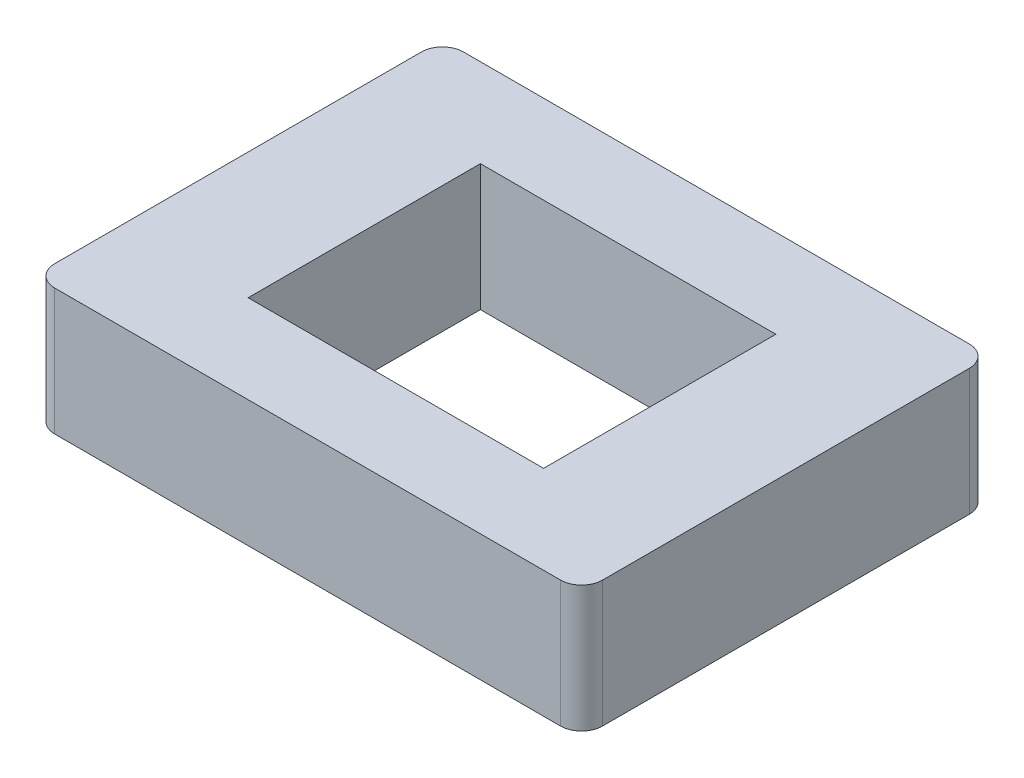
ISO-10303-21;
HEADER;
FILE_DESCRIPTION(('STEP AP214'),'2;1');
FILE_NAME('part.step','',(''),(''),'','','');
FILE_SCHEMA(('AUTOMOTIVE_DESIGN { 1 0 10303 214 1 1 1 1 }'));
ENDSEC;
DATA;
#1=APPLICATION_CONTEXT('core data for automotive mechanical design processes');
#2=APPLICATION_PROTOCOL_DEFINITION('international standard','automotive_design',2000,#1);
#3=PRODUCT_CONTEXT('',#1,'mechanical');
#4=PRODUCT('Part','Part','',(#3));
#5=PRODUCT_RELATED_PRODUCT_CATEGORY('part','',(#4));
#6=PRODUCT_DEFINITION_FORMATION('','',#4);
#7=PRODUCT_DEFINITION_CONTEXT('part definition',#1,'design');
#8=PRODUCT_DEFINITION('design','',#6,#7);
#9=PRODUCT_DEFINITION_SHAPE('','',#8);
#10=(LENGTH_UNIT() NAMED_UNIT(*) SI_UNIT(.MILLI.,.METRE.));
#11=(NAMED_UNIT(*) PLANE_ANGLE_UNIT() SI_UNIT($,.RADIAN.));
#12=(NAMED_UNIT(*) SI_UNIT($,.STERADIAN.) SOLID_ANGLE_UNIT());
#13=UNCERTAINTY_MEASURE_WITH_UNIT(LENGTH_MEASURE(1.E-05),#10,'distance_accuracy_value','');
#14=(GEOMETRIC_REPRESENTATION_CONTEXT(3) GLOBAL_UNCERTAINTY_ASSIGNED_CONTEXT((#13)) GLOBAL_UNIT_ASSIGNED_CONTEXT((#10,
#11,#12)) REPRESENTATION_CONTEXT('',''));
#15=CARTESIAN_POINT('',(0.,0.,0.));
#16=DIRECTION('',(0.,0.,1.));
#17=DIRECTION('',(1.,0.,0.));
#18=AXIS2_PLACEMENT_3D('',#15,#16,#17);
#19=CARTESIAN_POINT('',(0.,-30.,0.));
#20=DIRECTION('',(0.,-1.,0.));
#21=DIRECTION('',(0.,0.,-1.));
#22=AXIS2_PLACEMENT_3D('',#19,#20,#21);
#23=PLANE('',#22);
#24=DIRECTION('',(0.,0.,1.));
#25=VECTOR('',#24,1.);
#26=CARTESIAN_POINT('',(-65.,-30.,48.5));
#27=LINE('',#26,#25);
#28=CARTESIAN_POINT('',(-65.,-30.,-43.5));
#29=VERTEX_POINT('',#28);
#30=CARTESIAN_POINT('',(-65.,-30.,43.5));
#31=VERTEX_POINT('',#30);
#32=EDGE_CURVE('E174',#29,#31,#27,.T.);
#33=ORIENTED_EDGE('',*,*,#32,.F.);
#34=CARTESIAN_POINT('',(-60.,-30.,-43.5));
#35=DIRECTION('',(0.,-1.,0.));
#36=DIRECTION('',(0.,0.,-1.));
#37=AXIS2_PLACEMENT_3D('',#34,#35,#36);
#38=CIRCLE('',#37,5.);
#39=CARTESIAN_POINT('',(-60.,-30.,-48.5));
#40=VERTEX_POINT('',#39);
#41=EDGE_CURVE('E214',#29,#40,#38,.T.);
#42=ORIENTED_EDGE('',*,*,#41,.T.);
#43=DIRECTION('',(-1.,0.,0.));
#44=VECTOR('',#43,1.);
#45=CARTESIAN_POINT('',(-65.,-30.,-48.5));
#46=LINE('',#45,#44);
#47=CARTESIAN_POINT('',(60.,-30.,-48.5));
#48=VERTEX_POINT('',#47);
#49=EDGE_CURVE('E170',#48,#40,#46,.T.);
#50=ORIENTED_EDGE('',*,*,#49,.F.);
#51=CARTESIAN_POINT('',(60.,-30.,-43.5));
#52=DIRECTION('',(0.,-1.,0.));
#53=DIRECTION('',(0.,0.,-1.));
#54=AXIS2_PLACEMENT_3D('',#51,#52,#53);
#55=CIRCLE('',#54,5.);
#56=CARTESIAN_POINT('',(65.,-30.,-43.5));
#57=VERTEX_POINT('',#56);
#58=EDGE_CURVE('E210',#48,#57,#55,.T.);
#59=ORIENTED_EDGE('',*,*,#58,.T.);
#60=DIRECTION('',(0.,0.,-1.));
#61=VECTOR('',#60,1.);
#62=CARTESIAN_POINT('',(65.,-30.,48.5));
#63=LINE('',#62,#61);
#64=CARTESIAN_POINT('',(65.,-30.,43.5));
#65=VERTEX_POINT('',#64);
#66=EDGE_CURVE('E167',#65,#57,#63,.T.);
#67=ORIENTED_EDGE('',*,*,#66,.F.);
#68=CARTESIAN_POINT('',(60.,-30.,43.5));
#69=DIRECTION('',(0.,-1.,0.));
#70=DIRECTION('',(0.,0.,-1.));
#71=AXIS2_PLACEMENT_3D('',#68,#69,#70);
#72=CIRCLE('',#71,5.);
#73=CARTESIAN_POINT('',(60.,-30.,48.5));
#74=VERTEX_POINT('',#73);
#75=EDGE_CURVE('E208',#65,#74,#72,.T.);
#76=ORIENTED_EDGE('',*,*,#75,.T.);
#77=DIRECTION('',(1.,0.,0.));
#78=VECTOR('',#77,1.);
#79=CARTESIAN_POINT('',(-65.,-30.,48.5));
#80=LINE('',#79,#78);
#81=CARTESIAN_POINT('',(-60.,-30.,48.5));
#82=VERTEX_POINT('',#81);
#83=EDGE_CURVE('E177',#82,#74,#80,.T.);
#84=ORIENTED_EDGE('',*,*,#83,.F.);
#85=CARTESIAN_POINT('',(-60.,-30.,43.5));
#86=DIRECTION('',(0.,-1.,0.));
#87=DIRECTION('',(0.,0.,-1.));
#88=AXIS2_PLACEMENT_3D('',#85,#86,#87);
#89=CIRCLE('',#88,5.);
#90=EDGE_CURVE('E212',#82,#31,#89,.T.);
#91=ORIENTED_EDGE('',*,*,#90,.T.);
#92=EDGE_LOOP('',(#33,#42,#50,#59,#67,#76,#84,#91));
#93=FACE_BOUND('',#92,.T.);
#94=DIRECTION('',(1.,0.,0.));
#95=VECTOR('',#94,1.);
#96=CARTESIAN_POINT('',(-35.05,-30.,27.55));
#97=LINE('',#96,#95);
#98=CARTESIAN_POINT('',(-35.05,-30.,27.55));
#99=VERTEX_POINT('',#98);
#100=CARTESIAN_POINT('',(35.05,-30.,27.55));
#101=VERTEX_POINT('',#100);
#102=EDGE_CURVE('E139',#99,#101,#97,.T.);
#103=ORIENTED_EDGE('',*,*,#102,.T.);
#104=DIRECTION('',(0.,0.,-1.));
#105=VECTOR('',#104,1.);
#106=CARTESIAN_POINT('',(35.05,-30.,27.55));
#107=LINE('',#106,#105);
#108=CARTESIAN_POINT('',(35.05,-30.,-27.55));
#109=VERTEX_POINT('',#108);
#110=EDGE_CURVE('E56',#101,#109,#107,.T.);
#111=ORIENTED_EDGE('',*,*,#110,.T.);
#112=DIRECTION('',(-1.,0.,0.));
#113=VECTOR('',#112,1.);
#114=CARTESIAN_POINT('',(35.05,-30.,-27.55));
#115=LINE('',#114,#113);
#116=CARTESIAN_POINT('',(-35.05,-30.,-27.55));
#117=VERTEX_POINT('',#116);
#118=EDGE_CURVE('E145',#109,#117,#115,.T.);
#119=ORIENTED_EDGE('',*,*,#118,.T.);
#120=DIRECTION('',(0.,0.,1.));
#121=VECTOR('',#120,1.);
#122=CARTESIAN_POINT('',(-35.05,-30.,-27.55));
#123=LINE('',#122,#121);
#124=EDGE_CURVE('E159',#117,#99,#123,.T.);
#125=ORIENTED_EDGE('',*,*,#124,.T.);
#126=EDGE_LOOP('',(#103,#111,#119,#125));
#127=FACE_BOUND('',#126,.T.);
#128=ADVANCED_FACE('F41',(#93,#127),#23,.T.);
#129=CARTESIAN_POINT('',(0.,0.,0.));
#130=DIRECTION('',(0.,-1.,0.));
#131=DIRECTION('',(0.,0.,-1.));
#132=AXIS2_PLACEMENT_3D('',#129,#130,#131);
#133=PLANE('',#132);
#134=DIRECTION('',(-1.,0.,0.));
#135=VECTOR('',#134,1.);
#136=CARTESIAN_POINT('',(-65.,0.,-48.5));
#137=LINE('',#136,#135);
#138=CARTESIAN_POINT('',(60.,0.,-48.5));
#139=VERTEX_POINT('',#138);
#140=CARTESIAN_POINT('',(-60.,0.,-48.5));
#141=VERTEX_POINT('',#140);
#142=EDGE_CURVE('E183',#139,#141,#137,.T.);
#143=ORIENTED_EDGE('',*,*,#142,.T.);
#144=CARTESIAN_POINT('',(-60.,0.,-43.5));
#145=DIRECTION('',(0.,-1.,0.));
#146=DIRECTION('',(0.,0.,-1.));
#147=AXIS2_PLACEMENT_3D('',#144,#145,#146);
#148=CIRCLE('',#147,5.);
#149=CARTESIAN_POINT('',(-65.,0.,-43.5));
#150=VERTEX_POINT('',#149);
#151=EDGE_CURVE('E201',#141,#150,#148,.F.);
#152=ORIENTED_EDGE('',*,*,#151,.T.);
#153=DIRECTION('',(0.,0.,1.));
#154=VECTOR('',#153,1.);
#155=CARTESIAN_POINT('',(-65.,0.,48.5));
#156=LINE('',#155,#154);
#157=CARTESIAN_POINT('',(-65.,0.,43.5));
#158=VERTEX_POINT('',#157);
#159=EDGE_CURVE('E186',#150,#158,#156,.T.);
#160=ORIENTED_EDGE('',*,*,#159,.T.);
#161=CARTESIAN_POINT('',(-60.,0.,43.5));
#162=DIRECTION('',(0.,-1.,0.));
#163=DIRECTION('',(0.,0.,-1.));
#164=AXIS2_PLACEMENT_3D('',#161,#162,#163);
#165=CIRCLE('',#164,5.);
#166=CARTESIAN_POINT('',(-60.,0.,48.5));
#167=VERTEX_POINT('',#166);
#168=EDGE_CURVE('E199',#158,#167,#165,.F.);
#169=ORIENTED_EDGE('',*,*,#168,.T.);
#170=DIRECTION('',(1.,0.,0.));
#171=VECTOR('',#170,1.);
#172=CARTESIAN_POINT('',(-65.,0.,48.5));
#173=LINE('',#172,#171);
#174=CARTESIAN_POINT('',(60.,0.,48.5));
#175=VERTEX_POINT('',#174);
#176=EDGE_CURVE('E171',#167,#175,#173,.T.);
#177=ORIENTED_EDGE('',*,*,#176,.T.);
#178=CARTESIAN_POINT('',(60.,0.,43.5));
#179=DIRECTION('',(0.,-1.,0.));
#180=DIRECTION('',(0.,0.,-1.));
#181=AXIS2_PLACEMENT_3D('',#178,#179,#180);
#182=CIRCLE('',#181,5.);
#183=CARTESIAN_POINT('',(65.,0.,43.5));
#184=VERTEX_POINT('',#183);
#185=EDGE_CURVE('E195',#175,#184,#182,.F.);
#186=ORIENTED_EDGE('',*,*,#185,.T.);
#187=DIRECTION('',(0.,0.,-1.));
#188=VECTOR('',#187,1.);
#189=CARTESIAN_POINT('',(65.,0.,48.5));
#190=LINE('',#189,#188);
#191=CARTESIAN_POINT('',(65.,0.,-43.5));
#192=VERTEX_POINT('',#191);
#193=EDGE_CURVE('E146',#184,#192,#190,.T.);
#194=ORIENTED_EDGE('',*,*,#193,.T.);
#195=CARTESIAN_POINT('',(60.,0.,-43.5));
#196=DIRECTION('',(0.,-1.,0.));
#197=DIRECTION('',(0.,0.,-1.));
#198=AXIS2_PLACEMENT_3D('',#195,#196,#197);
#199=CIRCLE('',#198,5.);
#200=EDGE_CURVE('E197',#192,#139,#199,.F.);
#201=ORIENTED_EDGE('',*,*,#200,.T.);
#202=EDGE_LOOP('',(#143,#152,#160,#169,#177,#186,#194,#201));
#203=FACE_BOUND('',#202,.T.);
#204=DIRECTION('',(0.,0.,-1.));
#205=VECTOR('',#204,1.);
#206=CARTESIAN_POINT('',(35.05,0.,27.55));
#207=LINE('',#206,#205);
#208=CARTESIAN_POINT('',(35.05,0.,27.55));
#209=VERTEX_POINT('',#208);
#210=CARTESIAN_POINT('',(35.05,0.,-27.55));
#211=VERTEX_POINT('',#210);
#212=EDGE_CURVE('E130',#209,#211,#207,.T.);
#213=ORIENTED_EDGE('',*,*,#212,.F.);
#214=DIRECTION('',(1.,0.,0.));
#215=VECTOR('',#214,1.);
#216=CARTESIAN_POINT('',(-35.05,0.,27.55));
#217=LINE('',#216,#215);
#218=CARTESIAN_POINT('',(-35.05,0.,27.55));
#219=VERTEX_POINT('',#218);
#220=EDGE_CURVE('E153',#219,#209,#217,.T.);
#221=ORIENTED_EDGE('',*,*,#220,.F.);
#222=DIRECTION('',(0.,0.,1.));
#223=VECTOR('',#222,1.);
#224=CARTESIAN_POINT('',(-35.05,0.,-27.55));
#225=LINE('',#224,#223);
#226=CARTESIAN_POINT('',(-35.05,0.,-27.55));
#227=VERTEX_POINT('',#226);
#228=EDGE_CURVE('E151',#227,#219,#225,.T.);
#229=ORIENTED_EDGE('',*,*,#228,.F.);
#230=DIRECTION('',(-1.,0.,0.));
#231=VECTOR('',#230,1.);
#232=CARTESIAN_POINT('',(35.05,0.,-27.55));
#233=LINE('',#232,#231);
#234=EDGE_CURVE('E138',#211,#227,#233,.T.);
#235=ORIENTED_EDGE('',*,*,#234,.F.);
#236=EDGE_LOOP('',(#213,#221,#229,#235));
#237=FACE_BOUND('',#236,.T.);
#238=ADVANCED_FACE('F150',(#203,#237),#133,.F.);
#239=CARTESIAN_POINT('',(65.,-30.,48.5));
#240=DIRECTION('',(1.,0.,0.));
#241=DIRECTION('',(0.,0.,-1.));
#242=AXIS2_PLACEMENT_3D('',#239,#240,#241);
#243=PLANE('',#242);
#244=ORIENTED_EDGE('',*,*,#66,.T.);
#245=DIRECTION('',(0.,1.,0.));
#246=VECTOR('',#245,1.);
#247=CARTESIAN_POINT('',(65.,-30.,-43.5));
#248=LINE('',#247,#246);
#249=EDGE_CURVE('E11',#57,#192,#248,.T.);
#250=ORIENTED_EDGE('',*,*,#249,.T.);
#251=ORIENTED_EDGE('',*,*,#193,.F.);
#252=DIRECTION('',(0.,1.,0.));
#253=VECTOR('',#252,1.);
#254=CARTESIAN_POINT('',(65.,-30.,43.5));
#255=LINE('',#254,#253);
#256=EDGE_CURVE('E49',#184,#65,#255,.F.);
#257=ORIENTED_EDGE('',*,*,#256,.T.);
#258=EDGE_LOOP('',(#244,#250,#251,#257));
#259=FACE_BOUND('',#258,.T.);
#260=ADVANCED_FACE('F224',(#259),#243,.T.);
#261=CARTESIAN_POINT('',(-65.,-30.,48.5));
#262=DIRECTION('',(0.,0.,1.));
#263=DIRECTION('',(1.,0.,0.));
#264=AXIS2_PLACEMENT_3D('',#261,#262,#263);
#265=PLANE('',#264);
#266=ORIENTED_EDGE('',*,*,#176,.F.);
#267=DIRECTION('',(0.,1.,0.));
#268=VECTOR('',#267,1.);
#269=CARTESIAN_POINT('',(-60.,-30.,48.5));
#270=LINE('',#269,#268);
#271=EDGE_CURVE('E219',#167,#82,#270,.F.);
#272=ORIENTED_EDGE('',*,*,#271,.T.);
#273=ORIENTED_EDGE('',*,*,#83,.T.);
#274=DIRECTION('',(0.,1.,0.));
#275=VECTOR('',#274,1.);
#276=CARTESIAN_POINT('',(60.,-30.,48.5));
#277=LINE('',#276,#275);
#278=EDGE_CURVE('E216',#74,#175,#277,.T.);
#279=ORIENTED_EDGE('',*,*,#278,.T.);
#280=EDGE_LOOP('',(#266,#272,#273,#279));
#281=FACE_BOUND('',#280,.T.);
#282=ADVANCED_FACE('F237',(#281),#265,.T.);
#283=CARTESIAN_POINT('',(-65.,-30.,48.5));
#284=DIRECTION('',(-1.,0.,0.));
#285=DIRECTION('',(0.,0.,1.));
#286=AXIS2_PLACEMENT_3D('',#283,#284,#285);
#287=PLANE('',#286);
#288=ORIENTED_EDGE('',*,*,#159,.F.);
#289=DIRECTION('',(0.,1.,0.));
#290=VECTOR('',#289,1.);
#291=CARTESIAN_POINT('',(-65.,-30.,-43.5));
#292=LINE('',#291,#290);
#293=EDGE_CURVE('E206',#150,#29,#292,.F.);
#294=ORIENTED_EDGE('',*,*,#293,.T.);
#295=ORIENTED_EDGE('',*,*,#32,.T.);
#296=DIRECTION('',(0.,1.,0.));
#297=VECTOR('',#296,1.);
#298=CARTESIAN_POINT('',(-65.,-30.,43.5));
#299=LINE('',#298,#297);
#300=EDGE_CURVE('E203',#31,#158,#299,.T.);
#301=ORIENTED_EDGE('',*,*,#300,.T.);
#302=EDGE_LOOP('',(#288,#294,#295,#301));
#303=FACE_BOUND('',#302,.T.);
#304=ADVANCED_FACE('F246',(#303),#287,.T.);
#305=CARTESIAN_POINT('',(-65.,-30.,-48.5));
#306=DIRECTION('',(0.,0.,-1.));
#307=DIRECTION('',(-1.,0.,0.));
#308=AXIS2_PLACEMENT_3D('',#305,#306,#307);
#309=PLANE('',#308);
#310=ORIENTED_EDGE('',*,*,#49,.T.);
#311=DIRECTION('',(0.,1.,0.));
#312=VECTOR('',#311,1.);
#313=CARTESIAN_POINT('',(-60.,-30.,-48.5));
#314=LINE('',#313,#312);
#315=EDGE_CURVE('E192',#40,#141,#314,.T.);
#316=ORIENTED_EDGE('',*,*,#315,.T.);
#317=ORIENTED_EDGE('',*,*,#142,.F.);
#318=DIRECTION('',(0.,1.,0.));
#319=VECTOR('',#318,1.);
#320=CARTESIAN_POINT('',(60.,-30.,-48.5));
#321=LINE('',#320,#319);
#322=EDGE_CURVE('E180',#139,#48,#321,.F.);
#323=ORIENTED_EDGE('',*,*,#322,.T.);
#324=EDGE_LOOP('',(#310,#316,#317,#323));
#325=FACE_BOUND('',#324,.T.);
#326=ADVANCED_FACE('F254',(#325),#309,.T.);
#327=CARTESIAN_POINT('',(-60.,-30.,-43.5));
#328=DIRECTION('',(0.,1.,0.));
#329=DIRECTION('',(0.,0.,1.));
#330=AXIS2_PLACEMENT_3D('',#327,#328,#329);
#331=CYLINDRICAL_SURFACE('',#330,5.);
#332=ORIENTED_EDGE('',*,*,#41,.F.);
#333=ORIENTED_EDGE('',*,*,#293,.F.);
#334=ORIENTED_EDGE('',*,*,#151,.F.);
#335=ORIENTED_EDGE('',*,*,#315,.F.);
#336=EDGE_LOOP('',(#332,#333,#334,#335));
#337=FACE_BOUND('',#336,.T.);
#338=ADVANCED_FACE('F251',(#337),#331,.T.);
#339=CARTESIAN_POINT('',(-60.,-30.,43.5));
#340=DIRECTION('',(0.,1.,0.));
#341=DIRECTION('',(0.,0.,1.));
#342=AXIS2_PLACEMENT_3D('',#339,#340,#341);
#343=CYLINDRICAL_SURFACE('',#342,5.);
#344=ORIENTED_EDGE('',*,*,#90,.F.);
#345=ORIENTED_EDGE('',*,*,#271,.F.);
#346=ORIENTED_EDGE('',*,*,#168,.F.);
#347=ORIENTED_EDGE('',*,*,#300,.F.);
#348=EDGE_LOOP('',(#344,#345,#346,#347));
#349=FACE_BOUND('',#348,.T.);
#350=ADVANCED_FACE('F244',(#349),#343,.T.);
#351=CARTESIAN_POINT('',(60.,-30.,-43.5));
#352=DIRECTION('',(0.,1.,0.));
#353=DIRECTION('',(0.,0.,1.));
#354=AXIS2_PLACEMENT_3D('',#351,#352,#353);
#355=CYLINDRICAL_SURFACE('',#354,5.);
#356=ORIENTED_EDGE('',*,*,#58,.F.);
#357=ORIENTED_EDGE('',*,*,#322,.F.);
#358=ORIENTED_EDGE('',*,*,#200,.F.);
#359=ORIENTED_EDGE('',*,*,#249,.F.);
#360=EDGE_LOOP('',(#356,#357,#358,#359));
#361=FACE_BOUND('',#360,.T.);
#362=ADVANCED_FACE('F257',(#361),#355,.T.);
#363=CARTESIAN_POINT('',(60.,-30.,43.5));
#364=DIRECTION('',(0.,1.,0.));
#365=DIRECTION('',(0.,0.,1.));
#366=AXIS2_PLACEMENT_3D('',#363,#364,#365);
#367=CYLINDRICAL_SURFACE('',#366,5.);
#368=ORIENTED_EDGE('',*,*,#75,.F.);
#369=ORIENTED_EDGE('',*,*,#256,.F.);
#370=ORIENTED_EDGE('',*,*,#185,.F.);
#371=ORIENTED_EDGE('',*,*,#278,.F.);
#372=EDGE_LOOP('',(#368,#369,#370,#371));
#373=FACE_BOUND('',#372,.T.);
#374=ADVANCED_FACE('F43',(#373),#367,.T.);
#375=CARTESIAN_POINT('',(35.05,0.,27.55));
#376=DIRECTION('',(-1.,0.,0.));
#377=DIRECTION('',(0.,0.,1.));
#378=AXIS2_PLACEMENT_3D('',#375,#376,#377);
#379=PLANE('',#378);
#380=ORIENTED_EDGE('',*,*,#110,.F.);
#381=DIRECTION('',(0.,-1.,0.));
#382=VECTOR('',#381,1.);
#383=CARTESIAN_POINT('',(35.05,0.,27.55));
#384=LINE('',#383,#382);
#385=EDGE_CURVE('E134',#209,#101,#384,.T.);
#386=ORIENTED_EDGE('',*,*,#385,.F.);
#387=ORIENTED_EDGE('',*,*,#212,.T.);
#388=DIRECTION('',(0.,-1.,0.));
#389=VECTOR('',#388,1.);
#390=CARTESIAN_POINT('',(35.05,0.,-27.55));
#391=LINE('',#390,#389);
#392=EDGE_CURVE('E133',#211,#109,#391,.T.);
#393=ORIENTED_EDGE('',*,*,#392,.T.);
#394=EDGE_LOOP('',(#380,#386,#387,#393));
#395=FACE_BOUND('',#394,.T.);
#396=ADVANCED_FACE('F132',(#395),#379,.T.);
#397=CARTESIAN_POINT('',(35.05,0.,-27.55));
#398=DIRECTION('',(0.,0.,1.));
#399=DIRECTION('',(1.,0.,0.));
#400=AXIS2_PLACEMENT_3D('',#397,#398,#399);
#401=PLANE('',#400);
#402=ORIENTED_EDGE('',*,*,#118,.F.);
#403=ORIENTED_EDGE('',*,*,#392,.F.);
#404=ORIENTED_EDGE('',*,*,#234,.T.);
#405=DIRECTION('',(0.,-1.,0.));
#406=VECTOR('',#405,1.);
#407=CARTESIAN_POINT('',(-35.05,0.,-27.55));
#408=LINE('',#407,#406);
#409=EDGE_CURVE('E147',#227,#117,#408,.T.);
#410=ORIENTED_EDGE('',*,*,#409,.T.);
#411=EDGE_LOOP('',(#402,#403,#404,#410));
#412=FACE_BOUND('',#411,.T.);
#413=ADVANCED_FACE('F142',(#412),#401,.T.);
#414=CARTESIAN_POINT('',(-35.05,0.,-27.55));
#415=DIRECTION('',(1.,0.,0.));
#416=DIRECTION('',(0.,0.,-1.));
#417=AXIS2_PLACEMENT_3D('',#414,#415,#416);
#418=PLANE('',#417);
#419=ORIENTED_EDGE('',*,*,#124,.F.);
#420=ORIENTED_EDGE('',*,*,#409,.F.);
#421=ORIENTED_EDGE('',*,*,#228,.T.);
#422=DIRECTION('',(0.,-1.,0.));
#423=VECTOR('',#422,1.);
#424=CARTESIAN_POINT('',(-35.05,0.,27.55));
#425=LINE('',#424,#423);
#426=EDGE_CURVE('E64',#219,#99,#425,.T.);
#427=ORIENTED_EDGE('',*,*,#426,.T.);
#428=EDGE_LOOP('',(#419,#420,#421,#427));
#429=FACE_BOUND('',#428,.T.);
#430=ADVANCED_FACE('F327',(#429),#418,.T.);
#431=CARTESIAN_POINT('',(-35.05,0.,27.55));
#432=DIRECTION('',(0.,0.,-1.));
#433=DIRECTION('',(-1.,0.,0.));
#434=AXIS2_PLACEMENT_3D('',#431,#432,#433);
#435=PLANE('',#434);
#436=ORIENTED_EDGE('',*,*,#102,.F.);
#437=ORIENTED_EDGE('',*,*,#426,.F.);
#438=ORIENTED_EDGE('',*,*,#220,.T.);
#439=ORIENTED_EDGE('',*,*,#385,.T.);
#440=EDGE_LOOP('',(#436,#437,#438,#439));
#441=FACE_BOUND('',#440,.T.);
#442=ADVANCED_FACE('F335',(#441),#435,.T.);
#443=CLOSED_SHELL('',(#128,#238,#260,#282,#304,#326,#338,#350,#362,#374,#396,#413,#430,#442));
#444=MANIFOLD_SOLID_BREP('B2',#443);
#445=ADVANCED_BREP_SHAPE_REPRESENTATION('',(#18,#444),#14);
#446=SHAPE_DEFINITION_REPRESENTATION(#9,#445);
ENDSEC;
END-ISO-10303-21;
